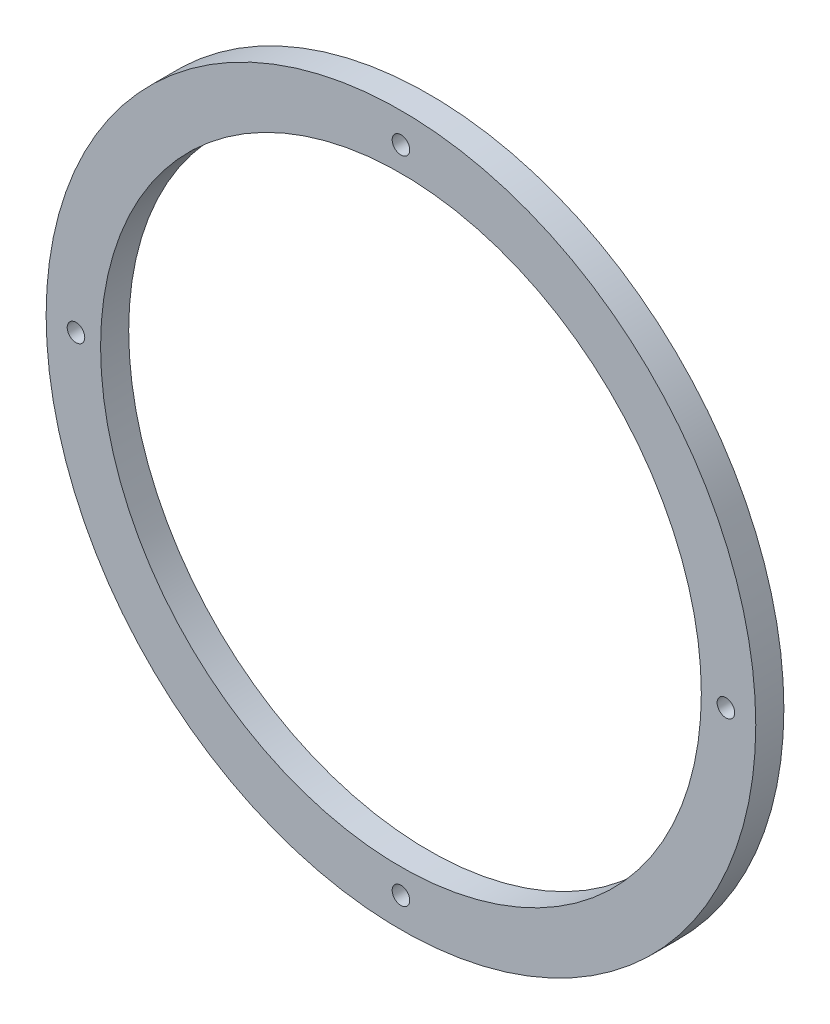
ISO-10303-21;
HEADER;
FILE_DESCRIPTION(('STEP AP214'),'2;1');
FILE_NAME('part.step','',(''),(''),'','','');
FILE_SCHEMA(('AUTOMOTIVE_DESIGN { 1 0 10303 214 1 1 1 1 }'));
ENDSEC;
DATA;
#1=APPLICATION_CONTEXT('core data for automotive mechanical design processes');
#2=APPLICATION_PROTOCOL_DEFINITION('international standard','automotive_design',2000,#1);
#3=PRODUCT_CONTEXT('',#1,'mechanical');
#4=PRODUCT('Part','Part','',(#3));
#5=PRODUCT_RELATED_PRODUCT_CATEGORY('part','',(#4));
#6=PRODUCT_DEFINITION_FORMATION('','',#4);
#7=PRODUCT_DEFINITION_CONTEXT('part definition',#1,'design');
#8=PRODUCT_DEFINITION('design','',#6,#7);
#9=PRODUCT_DEFINITION_SHAPE('','',#8);
#10=(LENGTH_UNIT() NAMED_UNIT(*) SI_UNIT(.MILLI.,.METRE.));
#11=(NAMED_UNIT(*) PLANE_ANGLE_UNIT() SI_UNIT($,.RADIAN.));
#12=(NAMED_UNIT(*) SI_UNIT($,.STERADIAN.) SOLID_ANGLE_UNIT());
#13=UNCERTAINTY_MEASURE_WITH_UNIT(LENGTH_MEASURE(1.E-05),#10,'distance_accuracy_value','');
#14=(GEOMETRIC_REPRESENTATION_CONTEXT(3) GLOBAL_UNCERTAINTY_ASSIGNED_CONTEXT((#13)) GLOBAL_UNIT_ASSIGNED_CONTEXT((#10,
#11,#12)) REPRESENTATION_CONTEXT('',''));
#15=CARTESIAN_POINT('',(0.,0.,0.));
#16=DIRECTION('',(0.,0.,1.));
#17=DIRECTION('',(1.,0.,0.));
#18=AXIS2_PLACEMENT_3D('',#15,#16,#17);
#19=CARTESIAN_POINT('',(0.,0.,8.));
#20=DIRECTION('',(0.,0.,1.));
#21=DIRECTION('',(1.,0.,0.));
#22=AXIS2_PLACEMENT_3D('',#19,#20,#21);
#23=PLANE('',#22);
#24=CARTESIAN_POINT('',(0.,92.5,8.));
#25=DIRECTION('',(0.,0.,1.));
#26=DIRECTION('',(1.,0.,0.));
#27=AXIS2_PLACEMENT_3D('',#24,#25,#26);
#28=CIRCLE('',#27,2.5);
#29=CARTESIAN_POINT('',(2.5,92.5,8.));
#30=VERTEX_POINT('',#29);
#31=EDGE_CURVE('E78',#30,#30,#28,.T.);
#32=ORIENTED_EDGE('',*,*,#31,.F.);
#33=EDGE_LOOP('',(#32));
#34=FACE_BOUND('',#33,.T.);
#35=CARTESIAN_POINT('',(92.5,0.,8.));
#36=DIRECTION('',(0.,0.,1.));
#37=DIRECTION('',(1.,0.,0.));
#38=AXIS2_PLACEMENT_3D('',#35,#36,#37);
#39=CIRCLE('',#38,2.5);
#40=CARTESIAN_POINT('',(95.,0.,8.));
#41=VERTEX_POINT('',#40);
#42=EDGE_CURVE('E75',#41,#41,#39,.T.);
#43=ORIENTED_EDGE('',*,*,#42,.F.);
#44=EDGE_LOOP('',(#43));
#45=FACE_BOUND('',#44,.T.);
#46=CARTESIAN_POINT('',(0.,-92.5,8.));
#47=DIRECTION('',(0.,0.,1.));
#48=DIRECTION('',(1.,0.,0.));
#49=AXIS2_PLACEMENT_3D('',#46,#47,#48);
#50=CIRCLE('',#49,2.5);
#51=CARTESIAN_POINT('',(2.50000000000002,-92.5,8.));
#52=VERTEX_POINT('',#51);
#53=EDGE_CURVE('E69',#52,#52,#50,.T.);
#54=ORIENTED_EDGE('',*,*,#53,.F.);
#55=EDGE_LOOP('',(#54));
#56=FACE_BOUND('',#55,.T.);
#57=CARTESIAN_POINT('',(-92.5,0.,8.));
#58=DIRECTION('',(0.,0.,1.));
#59=DIRECTION('',(1.,0.,0.));
#60=AXIS2_PLACEMENT_3D('',#57,#58,#59);
#61=CIRCLE('',#60,2.5);
#62=CARTESIAN_POINT('',(-90.,0.,8.));
#63=VERTEX_POINT('',#62);
#64=EDGE_CURVE('E63',#63,#63,#61,.T.);
#65=ORIENTED_EDGE('',*,*,#64,.F.);
#66=EDGE_LOOP('',(#65));
#67=FACE_BOUND('',#66,.T.);
#68=CARTESIAN_POINT('',(0.,0.,8.));
#69=DIRECTION('',(0.,0.,1.));
#70=DIRECTION('',(1.,0.,0.));
#71=AXIS2_PLACEMENT_3D('',#68,#69,#70);
#72=CIRCLE('',#71,101.);
#73=CARTESIAN_POINT('',(101.,0.,8.));
#74=VERTEX_POINT('',#73);
#75=EDGE_CURVE('E10',#74,#74,#72,.T.);
#76=ORIENTED_EDGE('',*,*,#75,.T.);
#77=EDGE_LOOP('',(#76));
#78=FACE_BOUND('',#77,.T.);
#79=CARTESIAN_POINT('',(0.,0.,8.));
#80=DIRECTION('',(0.,0.,1.));
#81=DIRECTION('',(1.,0.,0.));
#82=AXIS2_PLACEMENT_3D('',#79,#80,#81);
#83=CIRCLE('',#82,85.5);
#84=CARTESIAN_POINT('',(85.5,0.,8.));
#85=VERTEX_POINT('',#84);
#86=EDGE_CURVE('E52',#85,#85,#83,.T.);
#87=ORIENTED_EDGE('',*,*,#86,.F.);
#88=EDGE_LOOP('',(#87));
#89=FACE_BOUND('',#88,.T.);
#90=ADVANCED_FACE('F41',(#34,#45,#56,#67,#78,#89),#23,.T.);
#91=CARTESIAN_POINT('',(0.,0.,0.));
#92=DIRECTION('',(0.,0.,1.));
#93=DIRECTION('',(1.,0.,0.));
#94=AXIS2_PLACEMENT_3D('',#91,#92,#93);
#95=PLANE('',#94);
#96=CARTESIAN_POINT('',(0.,92.5,0.));
#97=DIRECTION('',(0.,0.,1.));
#98=DIRECTION('',(1.,0.,0.));
#99=AXIS2_PLACEMENT_3D('',#96,#97,#98);
#100=CIRCLE('',#99,2.5);
#101=CARTESIAN_POINT('',(2.5,92.5,0.));
#102=VERTEX_POINT('',#101);
#103=EDGE_CURVE('E57',#102,#102,#100,.T.);
#104=ORIENTED_EDGE('',*,*,#103,.T.);
#105=EDGE_LOOP('',(#104));
#106=FACE_BOUND('',#105,.T.);
#107=CARTESIAN_POINT('',(92.5,0.,0.));
#108=DIRECTION('',(0.,0.,1.));
#109=DIRECTION('',(1.,0.,0.));
#110=AXIS2_PLACEMENT_3D('',#107,#108,#109);
#111=CIRCLE('',#110,2.5);
#112=CARTESIAN_POINT('',(95.,0.,0.));
#113=VERTEX_POINT('',#112);
#114=EDGE_CURVE('E72',#113,#113,#111,.T.);
#115=ORIENTED_EDGE('',*,*,#114,.T.);
#116=EDGE_LOOP('',(#115));
#117=FACE_BOUND('',#116,.T.);
#118=CARTESIAN_POINT('',(0.,-92.5,0.));
#119=DIRECTION('',(0.,0.,1.));
#120=DIRECTION('',(1.,0.,0.));
#121=AXIS2_PLACEMENT_3D('',#118,#119,#120);
#122=CIRCLE('',#121,2.5);
#123=CARTESIAN_POINT('',(2.50000000000002,-92.5,0.));
#124=VERTEX_POINT('',#123);
#125=EDGE_CURVE('E66',#124,#124,#122,.T.);
#126=ORIENTED_EDGE('',*,*,#125,.T.);
#127=EDGE_LOOP('',(#126));
#128=FACE_BOUND('',#127,.T.);
#129=CARTESIAN_POINT('',(-92.5,0.,0.));
#130=DIRECTION('',(0.,0.,1.));
#131=DIRECTION('',(1.,0.,0.));
#132=AXIS2_PLACEMENT_3D('',#129,#130,#131);
#133=CIRCLE('',#132,2.5);
#134=CARTESIAN_POINT('',(-90.,0.,0.));
#135=VERTEX_POINT('',#134);
#136=EDGE_CURVE('E60',#135,#135,#133,.T.);
#137=ORIENTED_EDGE('',*,*,#136,.T.);
#138=EDGE_LOOP('',(#137));
#139=FACE_BOUND('',#138,.T.);
#140=CARTESIAN_POINT('',(0.,0.,0.));
#141=DIRECTION('',(0.,0.,1.));
#142=DIRECTION('',(1.,0.,0.));
#143=AXIS2_PLACEMENT_3D('',#140,#141,#142);
#144=CIRCLE('',#143,101.);
#145=CARTESIAN_POINT('',(101.,0.,0.));
#146=VERTEX_POINT('',#145);
#147=EDGE_CURVE('E45',#146,#146,#144,.T.);
#148=ORIENTED_EDGE('',*,*,#147,.F.);
#149=EDGE_LOOP('',(#148));
#150=FACE_BOUND('',#149,.T.);
#151=CARTESIAN_POINT('',(0.,0.,0.));
#152=DIRECTION('',(0.,0.,1.));
#153=DIRECTION('',(1.,0.,0.));
#154=AXIS2_PLACEMENT_3D('',#151,#152,#153);
#155=CIRCLE('',#154,85.5);
#156=CARTESIAN_POINT('',(85.5,0.,0.));
#157=VERTEX_POINT('',#156);
#158=EDGE_CURVE('E54',#157,#157,#155,.T.);
#159=ORIENTED_EDGE('',*,*,#158,.T.);
#160=EDGE_LOOP('',(#159));
#161=FACE_BOUND('',#160,.T.);
#162=ADVANCED_FACE('F84',(#106,#117,#128,#139,#150,#161),#95,.F.);
#163=CARTESIAN_POINT('',(0.,0.,8.));
#164=DIRECTION('',(0.,0.,-1.));
#165=DIRECTION('',(-1.,0.,0.));
#166=AXIS2_PLACEMENT_3D('',#163,#164,#165);
#167=CYLINDRICAL_SURFACE('',#166,101.);
#168=ORIENTED_EDGE('',*,*,#75,.F.);
#169=EDGE_LOOP('',(#168));
#170=FACE_BOUND('',#169,.T.);
#171=ORIENTED_EDGE('',*,*,#147,.T.);
#172=EDGE_LOOP('',(#171));
#173=FACE_BOUND('',#172,.T.);
#174=ADVANCED_FACE('F43',(#170,#173),#167,.T.);
#175=CARTESIAN_POINT('',(0.,0.,8.));
#176=DIRECTION('',(0.,0.,-1.));
#177=DIRECTION('',(-1.,0.,0.));
#178=AXIS2_PLACEMENT_3D('',#175,#176,#177);
#179=CYLINDRICAL_SURFACE('',#178,85.5);
#180=ORIENTED_EDGE('',*,*,#86,.T.);
#181=EDGE_LOOP('',(#180));
#182=FACE_BOUND('',#181,.T.);
#183=ORIENTED_EDGE('',*,*,#158,.F.);
#184=EDGE_LOOP('',(#183));
#185=FACE_BOUND('',#184,.T.);
#186=ADVANCED_FACE('F105',(#182,#185),#179,.F.);
#187=CARTESIAN_POINT('',(-92.5,0.,0.));
#188=DIRECTION('',(0.,0.,1.));
#189=DIRECTION('',(1.,0.,0.));
#190=AXIS2_PLACEMENT_3D('',#187,#188,#189);
#191=CYLINDRICAL_SURFACE('',#190,2.5);
#192=ORIENTED_EDGE('',*,*,#136,.F.);
#193=EDGE_LOOP('',(#192));
#194=FACE_BOUND('',#193,.T.);
#195=ORIENTED_EDGE('',*,*,#64,.T.);
#196=EDGE_LOOP('',(#195));
#197=FACE_BOUND('',#196,.T.);
#198=ADVANCED_FACE('F108',(#194,#197),#191,.F.);
#199=CARTESIAN_POINT('',(0.,-92.5,0.));
#200=DIRECTION('',(0.,0.,1.));
#201=DIRECTION('',(1.,0.,0.));
#202=AXIS2_PLACEMENT_3D('',#199,#200,#201);
#203=CYLINDRICAL_SURFACE('',#202,2.5);
#204=ORIENTED_EDGE('',*,*,#125,.F.);
#205=EDGE_LOOP('',(#204));
#206=FACE_BOUND('',#205,.T.);
#207=ORIENTED_EDGE('',*,*,#53,.T.);
#208=EDGE_LOOP('',(#207));
#209=FACE_BOUND('',#208,.T.);
#210=ADVANCED_FACE('F121',(#206,#209),#203,.F.);
#211=CARTESIAN_POINT('',(92.5,0.,0.));
#212=DIRECTION('',(0.,0.,1.));
#213=DIRECTION('',(1.,0.,0.));
#214=AXIS2_PLACEMENT_3D('',#211,#212,#213);
#215=CYLINDRICAL_SURFACE('',#214,2.5);
#216=ORIENTED_EDGE('',*,*,#114,.F.);
#217=EDGE_LOOP('',(#216));
#218=FACE_BOUND('',#217,.T.);
#219=ORIENTED_EDGE('',*,*,#42,.T.);
#220=EDGE_LOOP('',(#219));
#221=FACE_BOUND('',#220,.T.);
#222=ADVANCED_FACE('F90',(#218,#221),#215,.F.);
#223=CARTESIAN_POINT('',(0.,92.5,0.));
#224=DIRECTION('',(0.,0.,1.));
#225=DIRECTION('',(1.,0.,0.));
#226=AXIS2_PLACEMENT_3D('',#223,#224,#225);
#227=CYLINDRICAL_SURFACE('',#226,2.5);
#228=ORIENTED_EDGE('',*,*,#103,.F.);
#229=EDGE_LOOP('',(#228));
#230=FACE_BOUND('',#229,.T.);
#231=ORIENTED_EDGE('',*,*,#31,.T.);
#232=EDGE_LOOP('',(#231));
#233=FACE_BOUND('',#232,.T.);
#234=ADVANCED_FACE('F87',(#230,#233),#227,.F.);
#235=CLOSED_SHELL('',(#90,#162,#174,#186,#198,#210,#222,#234));
#236=MANIFOLD_SOLID_BREP('B2',#235);
#237=ADVANCED_BREP_SHAPE_REPRESENTATION('',(#18,#236),#14);
#238=SHAPE_DEFINITION_REPRESENTATION(#9,#237);
ENDSEC;
END-ISO-10303-21;
